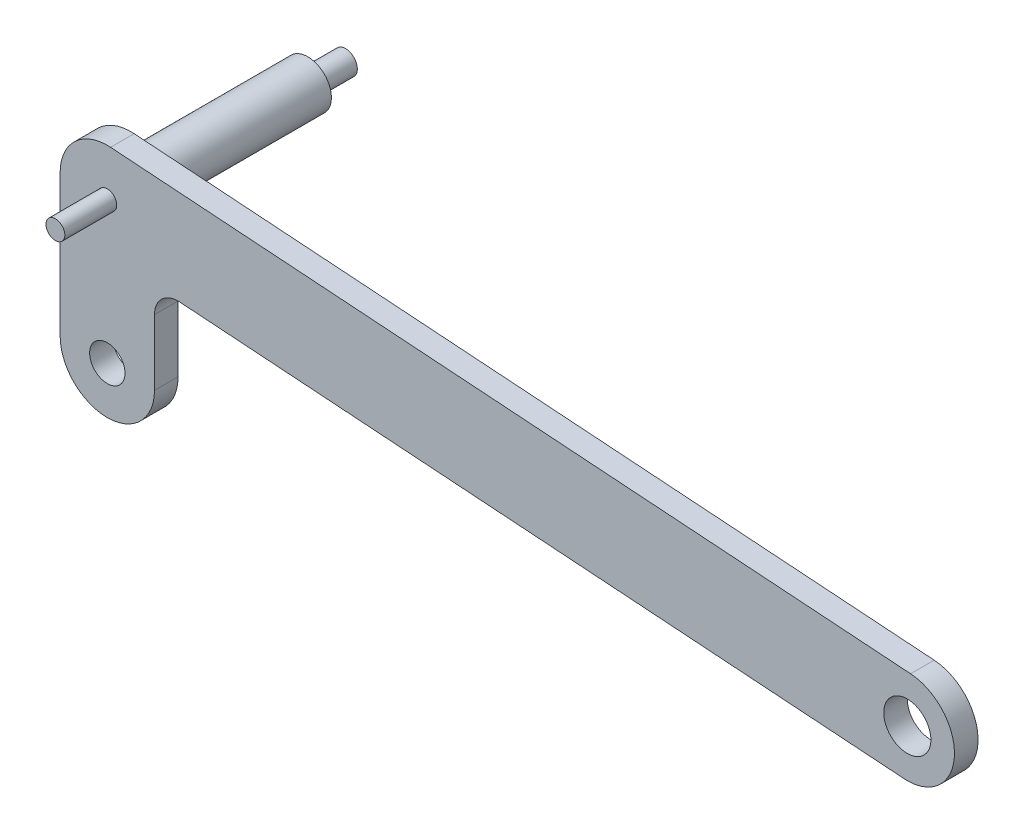
ISO-10303-21;
HEADER;
FILE_DESCRIPTION(('STEP AP214'),'2;1');
FILE_NAME('part.step','',(''),(''),'','','');
FILE_SCHEMA(('AUTOMOTIVE_DESIGN { 1 0 10303 214 1 1 1 1 }'));
ENDSEC;
DATA;
#1=APPLICATION_CONTEXT('core data for automotive mechanical design processes');
#2=APPLICATION_PROTOCOL_DEFINITION('international standard','automotive_design',2000,#1);
#3=PRODUCT_CONTEXT('',#1,'mechanical');
#4=PRODUCT('Part','Part','',(#3));
#5=PRODUCT_RELATED_PRODUCT_CATEGORY('part','',(#4));
#6=PRODUCT_DEFINITION_FORMATION('','',#4);
#7=PRODUCT_DEFINITION_CONTEXT('part definition',#1,'design');
#8=PRODUCT_DEFINITION('design','',#6,#7);
#9=PRODUCT_DEFINITION_SHAPE('','',#8);
#10=(LENGTH_UNIT() NAMED_UNIT(*) SI_UNIT(.MILLI.,.METRE.));
#11=(NAMED_UNIT(*) PLANE_ANGLE_UNIT() SI_UNIT($,.RADIAN.));
#12=(NAMED_UNIT(*) SI_UNIT($,.STERADIAN.) SOLID_ANGLE_UNIT());
#13=UNCERTAINTY_MEASURE_WITH_UNIT(LENGTH_MEASURE(1.E-05),#10,'distance_accuracy_value','');
#14=(GEOMETRIC_REPRESENTATION_CONTEXT(3) GLOBAL_UNCERTAINTY_ASSIGNED_CONTEXT((#13)) GLOBAL_UNIT_ASSIGNED_CONTEXT((#10,
#11,#12)) REPRESENTATION_CONTEXT('',''));
#15=CARTESIAN_POINT('',(0.,0.,0.));
#16=DIRECTION('',(0.,0.,1.));
#17=DIRECTION('',(1.,0.,0.));
#18=AXIS2_PLACEMENT_3D('',#15,#16,#17);
#19=CARTESIAN_POINT('',(30.,27.8289386992594,10.));
#20=DIRECTION('',(0.,0.,-1.));
#21=DIRECTION('',(-1.,0.,0.));
#22=AXIS2_PLACEMENT_3D('',#19,#20,#21);
#23=CYLINDRICAL_SURFACE('',#22,10.);
#24=CARTESIAN_POINT('',(30.,27.8289386992594,0.));
#25=DIRECTION('',(0.,0.,1.));
#26=DIRECTION('',(1.,0.,0.));
#27=AXIS2_PLACEMENT_3D('',#24,#25,#26);
#28=CIRCLE('',#27,10.);
#29=CARTESIAN_POINT('',(30.6975647374414,37.8045792018576,0.));
#30=VERTEX_POINT('',#29);
#31=CARTESIAN_POINT('',(20.,27.8289386992593,0.));
#32=VERTEX_POINT('',#31);
#33=EDGE_CURVE('E141',#30,#32,#28,.T.);
#34=ORIENTED_EDGE('',*,*,#33,.F.);
#35=DIRECTION('',(0.,0.,-1.));
#36=VECTOR('',#35,1.);
#37=CARTESIAN_POINT('',(30.6975647374414,37.8045792018576,10.));
#38=LINE('',#37,#36);
#39=CARTESIAN_POINT('',(30.6975647374414,37.8045792018576,10.));
#40=VERTEX_POINT('',#39);
#41=EDGE_CURVE('E39',#40,#30,#38,.T.);
#42=ORIENTED_EDGE('',*,*,#41,.F.);
#43=CARTESIAN_POINT('',(30.,27.8289386992594,10.));
#44=DIRECTION('',(0.,0.,1.));
#45=DIRECTION('',(1.,0.,0.));
#46=AXIS2_PLACEMENT_3D('',#43,#44,#45);
#47=CIRCLE('',#46,10.);
#48=CARTESIAN_POINT('',(20.,27.8289386992593,10.));
#49=VERTEX_POINT('',#48);
#50=EDGE_CURVE('E166',#40,#49,#47,.T.);
#51=ORIENTED_EDGE('',*,*,#50,.T.);
#52=DIRECTION('',(0.,0.,-1.));
#53=VECTOR('',#52,1.);
#54=CARTESIAN_POINT('',(20.,27.8289386992593,10.));
#55=LINE('',#54,#53);
#56=EDGE_CURVE('E89',#49,#32,#55,.T.);
#57=ORIENTED_EDGE('',*,*,#56,.T.);
#58=EDGE_LOOP('',(#34,#42,#51,#57));
#59=FACE_BOUND('',#58,.T.);
#60=ADVANCED_FACE('F36',(#59),#23,.F.);
#61=CARTESIAN_POINT('',(2.7800635539196,39.7567610570506,10.));
#62=DIRECTION('',(0.0697564737441289,0.997564050259824,0.));
#63=DIRECTION('',(-0.997564050259824,0.0697564737441289,0.));
#64=AXIS2_PLACEMENT_3D('',#61,#62,#63);
#65=PLANE('',#64);
#66=DIRECTION('',(0.997564050259824,-0.0697564737441289,0.));
#67=VECTOR('',#66,1.);
#68=CARTESIAN_POINT('',(2.7800635539196,39.7567610570506,0.));
#69=LINE('',#68,#67);
#70=CARTESIAN_POINT('',(337.776647613457,16.3315179217997,0.));
#71=VERTEX_POINT('',#70);
#72=EDGE_CURVE('E144',#30,#71,#69,.T.);
#73=ORIENTED_EDGE('',*,*,#72,.T.);
#74=DIRECTION('',(0.,0.,-1.));
#75=VECTOR('',#74,1.);
#76=CARTESIAN_POINT('',(337.776647613457,16.3315179217997,10.));
#77=LINE('',#76,#75);
#78=CARTESIAN_POINT('',(337.776647613457,16.3315179217997,10.));
#79=VERTEX_POINT('',#78);
#80=EDGE_CURVE('E173',#79,#71,#77,.T.);
#81=ORIENTED_EDGE('',*,*,#80,.F.);
#82=DIRECTION('',(0.997564050259824,-0.0697564737441289,0.));
#83=VECTOR('',#82,1.);
#84=CARTESIAN_POINT('',(2.7800635539196,39.7567610570506,10.));
#85=LINE('',#84,#83);
#86=EDGE_CURVE('E188',#40,#79,#85,.T.);
#87=ORIENTED_EDGE('',*,*,#86,.F.);
#88=ORIENTED_EDGE('',*,*,#41,.T.);
#89=EDGE_LOOP('',(#73,#81,#87,#88));
#90=FACE_BOUND('',#89,.T.);
#91=ADVANCED_FACE('F212',(#90),#65,.F.);
#92=CARTESIAN_POINT('',(339.17177708834,36.2827989269962,10.));
#93=DIRECTION('',(0.,0.,-1.));
#94=DIRECTION('',(-1.,0.,0.));
#95=AXIS2_PLACEMENT_3D('',#92,#93,#94);
#96=CYLINDRICAL_SURFACE('',#95,20.);
#97=CARTESIAN_POINT('',(339.17177708834,36.2827989269962,0.));
#98=DIRECTION('',(0.,0.,1.));
#99=DIRECTION('',(1.,0.,0.));
#100=AXIS2_PLACEMENT_3D('',#97,#98,#99);
#101=CIRCLE('',#100,20.);
#102=CARTESIAN_POINT('',(340.566906563223,56.2340799321927,0.));
#103=VERTEX_POINT('',#102);
#104=EDGE_CURVE('E147',#71,#103,#101,.T.);
#105=ORIENTED_EDGE('',*,*,#104,.T.);
#106=DIRECTION('',(0.,0.,-1.));
#107=VECTOR('',#106,1.);
#108=CARTESIAN_POINT('',(340.566906563223,56.2340799321927,10.));
#109=LINE('',#108,#107);
#110=CARTESIAN_POINT('',(340.566906563223,56.2340799321927,10.));
#111=VERTEX_POINT('',#110);
#112=EDGE_CURVE('E172',#111,#103,#109,.T.);
#113=ORIENTED_EDGE('',*,*,#112,.F.);
#114=CARTESIAN_POINT('',(339.17177708834,36.2827989269962,10.));
#115=DIRECTION('',(0.,0.,1.));
#116=DIRECTION('',(1.,0.,0.));
#117=AXIS2_PLACEMENT_3D('',#114,#115,#116);
#118=CIRCLE('',#117,20.);
#119=EDGE_CURVE('E190',#79,#111,#118,.T.);
#120=ORIENTED_EDGE('',*,*,#119,.F.);
#121=ORIENTED_EDGE('',*,*,#80,.T.);
#122=EDGE_LOOP('',(#105,#113,#120,#121));
#123=FACE_BOUND('',#122,.T.);
#124=ADVANCED_FACE('F196',(#123),#96,.T.);
#125=CARTESIAN_POINT('',(5.57032250368475,79.6593230674435,10.));
#126=DIRECTION('',(0.0697564737441288,0.997564050259824,0.));
#127=DIRECTION('',(-0.997564050259824,0.0697564737441288,0.));
#128=AXIS2_PLACEMENT_3D('',#125,#126,#127);
#129=PLANE('',#128);
#130=DIRECTION('',(0.997564050259824,-0.0697564737441288,0.));
#131=VECTOR('',#130,1.);
#132=CARTESIAN_POINT('',(5.57032250368475,79.6593230674435,0.));
#133=LINE('',#132,#131);
#134=CARTESIAN_POINT('',(1.39512947488258,79.9512810051965,0.));
#135=VERTEX_POINT('',#134);
#136=EDGE_CURVE('E150',#135,#103,#133,.T.);
#137=ORIENTED_EDGE('',*,*,#136,.F.);
#138=DIRECTION('',(0.,0.,-1.));
#139=VECTOR('',#138,1.);
#140=CARTESIAN_POINT('',(1.39512947488258,79.9512810051965,10.));
#141=LINE('',#140,#139);
#142=CARTESIAN_POINT('',(1.39512947488258,79.9512810051965,10.));
#143=VERTEX_POINT('',#142);
#144=EDGE_CURVE('E170',#143,#135,#141,.T.);
#145=ORIENTED_EDGE('',*,*,#144,.F.);
#146=DIRECTION('',(0.997564050259824,-0.0697564737441288,0.));
#147=VECTOR('',#146,1.);
#148=CARTESIAN_POINT('',(5.57032250368475,79.6593230674435,10.));
#149=LINE('',#148,#147);
#150=EDGE_CURVE('E130',#143,#111,#149,.T.);
#151=ORIENTED_EDGE('',*,*,#150,.T.);
#152=ORIENTED_EDGE('',*,*,#112,.T.);
#153=EDGE_LOOP('',(#137,#145,#151,#152));
#154=FACE_BOUND('',#153,.T.);
#155=ADVANCED_FACE('F194',(#154),#129,.T.);
#156=CARTESIAN_POINT('',(0.,60.,10.));
#157=DIRECTION('',(0.,0.,-1.));
#158=DIRECTION('',(-1.,0.,0.));
#159=AXIS2_PLACEMENT_3D('',#156,#157,#158);
#160=CYLINDRICAL_SURFACE('',#159,20.);
#161=CARTESIAN_POINT('',(0.,60.,0.));
#162=DIRECTION('',(0.,0.,1.));
#163=DIRECTION('',(1.,0.,0.));
#164=AXIS2_PLACEMENT_3D('',#161,#162,#163);
#165=CIRCLE('',#164,20.);
#166=CARTESIAN_POINT('',(-20.,60.,0.));
#167=VERTEX_POINT('',#166);
#168=EDGE_CURVE('E153',#135,#167,#165,.T.);
#169=ORIENTED_EDGE('',*,*,#168,.T.);
#170=DIRECTION('',(0.,0.,-1.));
#171=VECTOR('',#170,1.);
#172=CARTESIAN_POINT('',(-20.,60.,10.));
#173=LINE('',#172,#171);
#174=CARTESIAN_POINT('',(-20.,60.,10.));
#175=VERTEX_POINT('',#174);
#176=EDGE_CURVE('E117',#175,#167,#173,.T.);
#177=ORIENTED_EDGE('',*,*,#176,.F.);
#178=CARTESIAN_POINT('',(0.,60.,10.));
#179=DIRECTION('',(0.,0.,1.));
#180=DIRECTION('',(1.,0.,0.));
#181=AXIS2_PLACEMENT_3D('',#178,#179,#180);
#182=CIRCLE('',#181,20.);
#183=EDGE_CURVE('E127',#143,#175,#182,.T.);
#184=ORIENTED_EDGE('',*,*,#183,.F.);
#185=ORIENTED_EDGE('',*,*,#144,.T.);
#186=EDGE_LOOP('',(#169,#177,#184,#185));
#187=FACE_BOUND('',#186,.T.);
#188=ADVANCED_FACE('F202',(#187),#160,.T.);
#189=CARTESIAN_POINT('',(-20.,0.,10.));
#190=DIRECTION('',(-1.,0.,0.));
#191=DIRECTION('',(0.,0.,1.));
#192=AXIS2_PLACEMENT_3D('',#189,#190,#191);
#193=PLANE('',#192);
#194=DIRECTION('',(0.,1.,0.));
#195=VECTOR('',#194,1.);
#196=CARTESIAN_POINT('',(-20.,0.,0.));
#197=LINE('',#196,#195);
#198=CARTESIAN_POINT('',(-20.,0.,0.));
#199=VERTEX_POINT('',#198);
#200=EDGE_CURVE('E116',#199,#167,#197,.T.);
#201=ORIENTED_EDGE('',*,*,#200,.F.);
#202=DIRECTION('',(0.,0.,-1.));
#203=VECTOR('',#202,1.);
#204=CARTESIAN_POINT('',(-20.,0.,10.));
#205=LINE('',#204,#203);
#206=CARTESIAN_POINT('',(-20.,0.,10.));
#207=VERTEX_POINT('',#206);
#208=EDGE_CURVE('E110',#207,#199,#205,.T.);
#209=ORIENTED_EDGE('',*,*,#208,.F.);
#210=DIRECTION('',(0.,1.,0.));
#211=VECTOR('',#210,1.);
#212=CARTESIAN_POINT('',(-20.,0.,10.));
#213=LINE('',#212,#211);
#214=EDGE_CURVE('E114',#207,#175,#213,.T.);
#215=ORIENTED_EDGE('',*,*,#214,.T.);
#216=ORIENTED_EDGE('',*,*,#176,.T.);
#217=EDGE_LOOP('',(#201,#209,#215,#216));
#218=FACE_BOUND('',#217,.T.);
#219=ADVANCED_FACE('F112',(#218),#193,.T.);
#220=CARTESIAN_POINT('',(0.,0.,10.));
#221=DIRECTION('',(0.,0.,-1.));
#222=DIRECTION('',(-1.,0.,0.));
#223=AXIS2_PLACEMENT_3D('',#220,#221,#222);
#224=CYLINDRICAL_SURFACE('',#223,20.);
#225=CARTESIAN_POINT('',(0.,0.,0.));
#226=DIRECTION('',(0.,0.,1.));
#227=DIRECTION('',(1.,0.,0.));
#228=AXIS2_PLACEMENT_3D('',#225,#226,#227);
#229=CIRCLE('',#228,20.);
#230=CARTESIAN_POINT('',(20.,0.,0.));
#231=VERTEX_POINT('',#230);
#232=EDGE_CURVE('E82',#199,#231,#229,.T.);
#233=ORIENTED_EDGE('',*,*,#232,.T.);
#234=DIRECTION('',(0.,0.,-1.));
#235=VECTOR('',#234,1.);
#236=CARTESIAN_POINT('',(20.,0.,10.));
#237=LINE('',#236,#235);
#238=CARTESIAN_POINT('',(20.,0.,10.));
#239=VERTEX_POINT('',#238);
#240=EDGE_CURVE('E118',#239,#231,#237,.T.);
#241=ORIENTED_EDGE('',*,*,#240,.F.);
#242=CARTESIAN_POINT('',(0.,0.,10.));
#243=DIRECTION('',(0.,0.,1.));
#244=DIRECTION('',(1.,0.,0.));
#245=AXIS2_PLACEMENT_3D('',#242,#243,#244);
#246=CIRCLE('',#245,20.);
#247=EDGE_CURVE('E120',#207,#239,#246,.T.);
#248=ORIENTED_EDGE('',*,*,#247,.F.);
#249=ORIENTED_EDGE('',*,*,#208,.T.);
#250=EDGE_LOOP('',(#233,#241,#248,#249));
#251=FACE_BOUND('',#250,.T.);
#252=ADVANCED_FACE('F121',(#251),#224,.T.);
#253=CARTESIAN_POINT('',(339.17177708834,36.2827989269962,10.));
#254=DIRECTION('',(0.,0.,-1.));
#255=DIRECTION('',(-1.,0.,0.));
#256=AXIS2_PLACEMENT_3D('',#253,#254,#255);
#257=CYLINDRICAL_SURFACE('',#256,9.99999999999998);
#258=CARTESIAN_POINT('',(339.17177708834,36.2827989269962,10.));
#259=DIRECTION('',(0.,0.,1.));
#260=DIRECTION('',(1.,0.,0.));
#261=AXIS2_PLACEMENT_3D('',#258,#259,#260);
#262=CIRCLE('',#261,9.99999999999998);
#263=CARTESIAN_POINT('',(349.17177708834,36.2827989269962,10.));
#264=VERTEX_POINT('',#263);
#265=EDGE_CURVE('E135',#264,#264,#262,.T.);
#266=ORIENTED_EDGE('',*,*,#265,.T.);
#267=EDGE_LOOP('',(#266));
#268=FACE_BOUND('',#267,.T.);
#269=CARTESIAN_POINT('',(339.17177708834,36.2827989269962,0.));
#270=DIRECTION('',(0.,0.,1.));
#271=DIRECTION('',(1.,0.,0.));
#272=AXIS2_PLACEMENT_3D('',#269,#270,#271);
#273=CIRCLE('',#272,9.99999999999998);
#274=CARTESIAN_POINT('',(349.17177708834,36.2827989269962,0.));
#275=VERTEX_POINT('',#274);
#276=EDGE_CURVE('E160',#275,#275,#273,.T.);
#277=ORIENTED_EDGE('',*,*,#276,.F.);
#278=EDGE_LOOP('',(#277));
#279=FACE_BOUND('',#278,.T.);
#280=ADVANCED_FACE('F221',(#268,#279),#257,.F.);
#281=CARTESIAN_POINT('',(20.,0.,10.));
#282=DIRECTION('',(-1.,0.,0.));
#283=DIRECTION('',(0.,-1.,0.));
#284=AXIS2_PLACEMENT_3D('',#281,#282,#283);
#285=PLANE('',#284);
#286=DIRECTION('',(0.,1.,0.));
#287=VECTOR('',#286,1.);
#288=CARTESIAN_POINT('',(20.,0.,0.));
#289=LINE('',#288,#287);
#290=EDGE_CURVE('E158',#231,#32,#289,.T.);
#291=ORIENTED_EDGE('',*,*,#290,.T.);
#292=ORIENTED_EDGE('',*,*,#56,.F.);
#293=DIRECTION('',(0.,1.,0.));
#294=VECTOR('',#293,1.);
#295=CARTESIAN_POINT('',(20.,0.,10.));
#296=LINE('',#295,#294);
#297=EDGE_CURVE('E54',#239,#49,#296,.T.);
#298=ORIENTED_EDGE('',*,*,#297,.F.);
#299=ORIENTED_EDGE('',*,*,#240,.T.);
#300=EDGE_LOOP('',(#291,#292,#298,#299));
#301=FACE_BOUND('',#300,.T.);
#302=ADVANCED_FACE('F218',(#301),#285,.F.);
#303=CARTESIAN_POINT('',(0.,0.,10.));
#304=DIRECTION('',(0.,0.,-1.));
#305=DIRECTION('',(-1.,0.,0.));
#306=AXIS2_PLACEMENT_3D('',#303,#304,#305);
#307=CYLINDRICAL_SURFACE('',#306,7.5);
#308=CARTESIAN_POINT('',(0.,0.,10.));
#309=DIRECTION('',(0.,0.,1.));
#310=DIRECTION('',(1.,0.,0.));
#311=AXIS2_PLACEMENT_3D('',#308,#309,#310);
#312=CIRCLE('',#311,7.5);
#313=CARTESIAN_POINT('',(7.5,0.,10.));
#314=VERTEX_POINT('',#313);
#315=EDGE_CURVE('E138',#314,#314,#312,.T.);
#316=ORIENTED_EDGE('',*,*,#315,.T.);
#317=EDGE_LOOP('',(#316));
#318=FACE_BOUND('',#317,.T.);
#319=CARTESIAN_POINT('',(0.,0.,0.));
#320=DIRECTION('',(0.,0.,1.));
#321=DIRECTION('',(1.,0.,0.));
#322=AXIS2_PLACEMENT_3D('',#319,#320,#321);
#323=CIRCLE('',#322,7.5);
#324=CARTESIAN_POINT('',(7.5,0.,0.));
#325=VERTEX_POINT('',#324);
#326=EDGE_CURVE('E163',#325,#325,#323,.T.);
#327=ORIENTED_EDGE('',*,*,#326,.F.);
#328=EDGE_LOOP('',(#327));
#329=FACE_BOUND('',#328,.T.);
#330=ADVANCED_FACE('F220',(#318,#329),#307,.F.);
#331=CARTESIAN_POINT('',(0.,0.,10.));
#332=DIRECTION('',(0.,0.,1.));
#333=DIRECTION('',(1.,0.,0.));
#334=AXIS2_PLACEMENT_3D('',#331,#332,#333);
#335=PLANE('',#334);
#336=CARTESIAN_POINT('',(0.,60.,10.));
#337=DIRECTION('',(0.,0.,1.));
#338=DIRECTION('',(1.,0.,0.));
#339=AXIS2_PLACEMENT_3D('',#336,#337,#338);
#340=CIRCLE('',#339,4.);
#341=CARTESIAN_POINT('',(4.,60.,10.));
#342=VERTEX_POINT('',#341);
#343=EDGE_CURVE('E337',#342,#342,#340,.T.);
#344=ORIENTED_EDGE('',*,*,#343,.F.);
#345=EDGE_LOOP('',(#344));
#346=FACE_BOUND('',#345,.T.);
#347=ORIENTED_EDGE('',*,*,#50,.F.);
#348=ORIENTED_EDGE('',*,*,#86,.T.);
#349=ORIENTED_EDGE('',*,*,#119,.T.);
#350=ORIENTED_EDGE('',*,*,#150,.F.);
#351=ORIENTED_EDGE('',*,*,#183,.T.);
#352=ORIENTED_EDGE('',*,*,#214,.F.);
#353=ORIENTED_EDGE('',*,*,#247,.T.);
#354=ORIENTED_EDGE('',*,*,#297,.T.);
#355=EDGE_LOOP('',(#347,#348,#349,#350,#351,#352,#353,#354));
#356=FACE_BOUND('',#355,.T.);
#357=ORIENTED_EDGE('',*,*,#265,.F.);
#358=EDGE_LOOP('',(#357));
#359=FACE_BOUND('',#358,.T.);
#360=ORIENTED_EDGE('',*,*,#315,.F.);
#361=EDGE_LOOP('',(#360));
#362=FACE_BOUND('',#361,.T.);
#363=ADVANCED_FACE('F123',(#346,#356,#359,#362),#335,.T.);
#364=CARTESIAN_POINT('',(0.,0.,0.));
#365=DIRECTION('',(0.,0.,1.));
#366=DIRECTION('',(1.,0.,0.));
#367=AXIS2_PLACEMENT_3D('',#364,#365,#366);
#368=PLANE('',#367);
#369=CARTESIAN_POINT('',(0.,60.,0.));
#370=DIRECTION('',(0.,0.,-1.));
#371=DIRECTION('',(-1.,0.,0.));
#372=AXIS2_PLACEMENT_3D('',#369,#370,#371);
#373=CIRCLE('',#372,10.);
#374=CARTESIAN_POINT('',(-10.,60.,0.));
#375=VERTEX_POINT('',#374);
#376=EDGE_CURVE('E45',#375,#375,#373,.T.);
#377=ORIENTED_EDGE('',*,*,#376,.F.);
#378=EDGE_LOOP('',(#377));
#379=FACE_BOUND('',#378,.T.);
#380=ORIENTED_EDGE('',*,*,#33,.T.);
#381=ORIENTED_EDGE('',*,*,#290,.F.);
#382=ORIENTED_EDGE('',*,*,#232,.F.);
#383=ORIENTED_EDGE('',*,*,#200,.T.);
#384=ORIENTED_EDGE('',*,*,#168,.F.);
#385=ORIENTED_EDGE('',*,*,#136,.T.);
#386=ORIENTED_EDGE('',*,*,#104,.F.);
#387=ORIENTED_EDGE('',*,*,#72,.F.);
#388=EDGE_LOOP('',(#380,#381,#382,#383,#384,#385,#386,#387));
#389=FACE_BOUND('',#388,.T.);
#390=ORIENTED_EDGE('',*,*,#276,.T.);
#391=EDGE_LOOP('',(#390));
#392=FACE_BOUND('',#391,.T.);
#393=ORIENTED_EDGE('',*,*,#326,.T.);
#394=EDGE_LOOP('',(#393));
#395=FACE_BOUND('',#394,.T.);
#396=ADVANCED_FACE('F199',(#379,#389,#392,#395),#368,.F.);
#397=CARTESIAN_POINT('',(0.,60.,-75.));
#398=DIRECTION('',(0.,0.,1.));
#399=DIRECTION('',(1.,0.,0.));
#400=AXIS2_PLACEMENT_3D('',#397,#398,#399);
#401=CYLINDRICAL_SURFACE('',#400,10.);
#402=CARTESIAN_POINT('',(0.,60.,-75.));
#403=DIRECTION('',(0.,0.,-1.));
#404=DIRECTION('',(-1.,0.,0.));
#405=AXIS2_PLACEMENT_3D('',#402,#403,#404);
#406=CIRCLE('',#405,10.);
#407=CARTESIAN_POINT('',(-10.,60.,-75.));
#408=VERTEX_POINT('',#407);
#409=EDGE_CURVE('E145',#408,#408,#406,.T.);
#410=ORIENTED_EDGE('',*,*,#409,.F.);
#411=EDGE_LOOP('',(#410));
#412=FACE_BOUND('',#411,.T.);
#413=ORIENTED_EDGE('',*,*,#376,.T.);
#414=EDGE_LOOP('',(#413));
#415=FACE_BOUND('',#414,.T.);
#416=ADVANCED_FACE('F262',(#412,#415),#401,.T.);
#417=CARTESIAN_POINT('',(0.,60.,-75.));
#418=DIRECTION('',(0.,0.,-1.));
#419=DIRECTION('',(-1.,0.,0.));
#420=AXIS2_PLACEMENT_3D('',#417,#418,#419);
#421=PLANE('',#420);
#422=CARTESIAN_POINT('',(0.,60.,-75.));
#423=DIRECTION('',(0.,0.,-1.));
#424=DIRECTION('',(-1.,0.,0.));
#425=AXIS2_PLACEMENT_3D('',#422,#423,#424);
#426=CIRCLE('',#425,5.);
#427=CARTESIAN_POINT('',(-5.,60.,-75.));
#428=VERTEX_POINT('',#427);
#429=EDGE_CURVE('E11',#428,#428,#426,.T.);
#430=ORIENTED_EDGE('',*,*,#429,.F.);
#431=EDGE_LOOP('',(#430));
#432=FACE_BOUND('',#431,.T.);
#433=ORIENTED_EDGE('',*,*,#409,.T.);
#434=EDGE_LOOP('',(#433));
#435=FACE_BOUND('',#434,.T.);
#436=ADVANCED_FACE('F272',(#432,#435),#421,.T.);
#437=CARTESIAN_POINT('',(0.,60.,-91.));
#438=DIRECTION('',(0.,0.,1.));
#439=DIRECTION('',(1.,0.,0.));
#440=AXIS2_PLACEMENT_3D('',#437,#438,#439);
#441=CYLINDRICAL_SURFACE('',#440,5.);
#442=CARTESIAN_POINT('',(0.,60.,-91.));
#443=DIRECTION('',(0.,0.,-1.));
#444=DIRECTION('',(-1.,0.,0.));
#445=AXIS2_PLACEMENT_3D('',#442,#443,#444);
#446=CIRCLE('',#445,5.);
#447=CARTESIAN_POINT('',(-5.,60.,-91.));
#448=VERTEX_POINT('',#447);
#449=EDGE_CURVE('E336',#448,#448,#446,.T.);
#450=ORIENTED_EDGE('',*,*,#449,.F.);
#451=EDGE_LOOP('',(#450));
#452=FACE_BOUND('',#451,.T.);
#453=ORIENTED_EDGE('',*,*,#429,.T.);
#454=EDGE_LOOP('',(#453));
#455=FACE_BOUND('',#454,.T.);
#456=ADVANCED_FACE('F282',(#452,#455),#441,.T.);
#457=CARTESIAN_POINT('',(0.,60.,-91.));
#458=DIRECTION('',(0.,0.,-1.));
#459=DIRECTION('',(-1.,0.,0.));
#460=AXIS2_PLACEMENT_3D('',#457,#458,#459);
#461=PLANE('',#460);
#462=ORIENTED_EDGE('',*,*,#449,.T.);
#463=EDGE_LOOP('',(#462));
#464=FACE_BOUND('',#463,.T.);
#465=ADVANCED_FACE('F292',(#464),#461,.T.);
#466=CARTESIAN_POINT('',(0.,60.,32.));
#467=DIRECTION('',(0.,0.,-1.));
#468=DIRECTION('',(-1.,0.,0.));
#469=AXIS2_PLACEMENT_3D('',#466,#467,#468);
#470=CYLINDRICAL_SURFACE('',#469,4.);
#471=CARTESIAN_POINT('',(0.,60.,32.));
#472=DIRECTION('',(0.,0.,1.));
#473=DIRECTION('',(1.,0.,0.));
#474=AXIS2_PLACEMENT_3D('',#471,#472,#473);
#475=CIRCLE('',#474,4.);
#476=CARTESIAN_POINT('',(4.,60.,32.));
#477=VERTEX_POINT('',#476);
#478=EDGE_CURVE('E335',#477,#477,#475,.T.);
#479=ORIENTED_EDGE('',*,*,#478,.F.);
#480=EDGE_LOOP('',(#479));
#481=FACE_BOUND('',#480,.T.);
#482=ORIENTED_EDGE('',*,*,#343,.T.);
#483=EDGE_LOOP('',(#482));
#484=FACE_BOUND('',#483,.T.);
#485=ADVANCED_FACE('F302',(#481,#484),#470,.T.);
#486=CARTESIAN_POINT('',(0.,60.,32.));
#487=DIRECTION('',(0.,0.,1.));
#488=DIRECTION('',(1.,0.,0.));
#489=AXIS2_PLACEMENT_3D('',#486,#487,#488);
#490=PLANE('',#489);
#491=ORIENTED_EDGE('',*,*,#478,.T.);
#492=EDGE_LOOP('',(#491));
#493=FACE_BOUND('',#492,.T.);
#494=ADVANCED_FACE('F319',(#493),#490,.T.);
#495=CLOSED_SHELL('',(#60,#91,#124,#155,#188,#219,#252,#280,#302,#330,#363,#396,#416,#436,#456,
#465,#485,#494));
#496=MANIFOLD_SOLID_BREP('B2',#495);
#497=ADVANCED_BREP_SHAPE_REPRESENTATION('',(#18,#496),#14);
#498=SHAPE_DEFINITION_REPRESENTATION(#9,#497);
ENDSEC;
END-ISO-10303-21;
